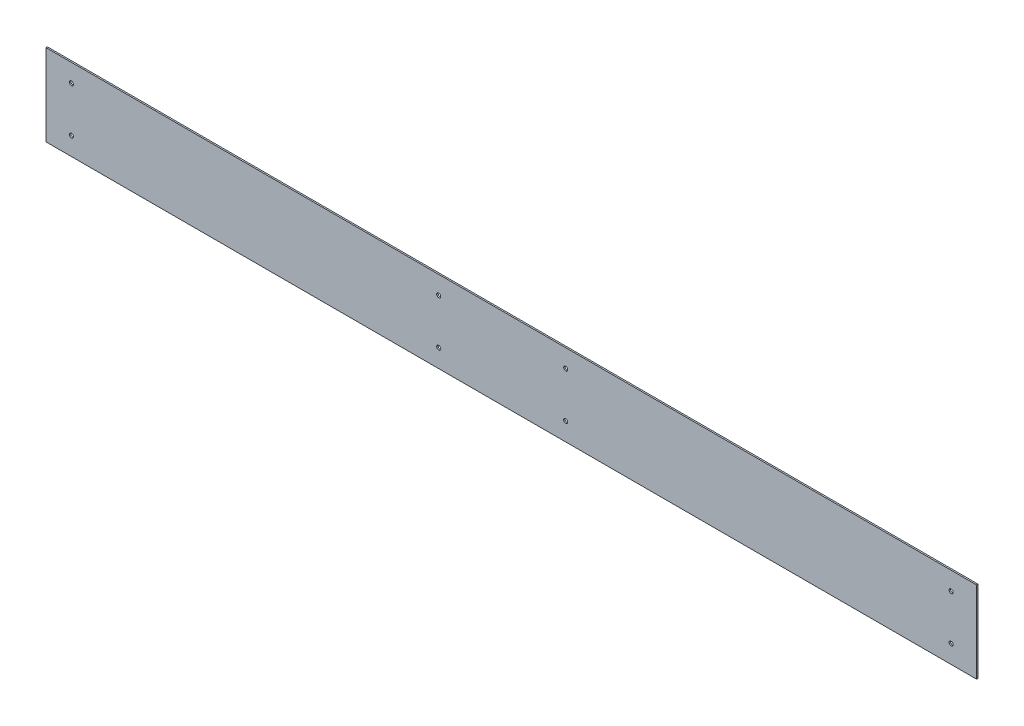
ISO-10303-21;
HEADER;
FILE_DESCRIPTION(('STEP AP214'),'2;1');
FILE_NAME('part.step','',(''),(''),'','','');
FILE_SCHEMA(('AUTOMOTIVE_DESIGN { 1 0 10303 214 1 1 1 1 }'));
ENDSEC;
DATA;
#1=APPLICATION_CONTEXT('core data for automotive mechanical design processes');
#2=APPLICATION_PROTOCOL_DEFINITION('international standard','automotive_design',2000,#1);
#3=PRODUCT_CONTEXT('',#1,'mechanical');
#4=PRODUCT('Part','Part','',(#3));
#5=PRODUCT_RELATED_PRODUCT_CATEGORY('part','',(#4));
#6=PRODUCT_DEFINITION_FORMATION('','',#4);
#7=PRODUCT_DEFINITION_CONTEXT('part definition',#1,'design');
#8=PRODUCT_DEFINITION('design','',#6,#7);
#9=PRODUCT_DEFINITION_SHAPE('','',#8);
#10=(LENGTH_UNIT() NAMED_UNIT(*) SI_UNIT(.MILLI.,.METRE.));
#11=(NAMED_UNIT(*) PLANE_ANGLE_UNIT() SI_UNIT($,.RADIAN.));
#12=(NAMED_UNIT(*) SI_UNIT($,.STERADIAN.) SOLID_ANGLE_UNIT());
#13=UNCERTAINTY_MEASURE_WITH_UNIT(LENGTH_MEASURE(1.E-05),#10,'distance_accuracy_value','');
#14=(GEOMETRIC_REPRESENTATION_CONTEXT(3) GLOBAL_UNCERTAINTY_ASSIGNED_CONTEXT((#13)) GLOBAL_UNIT_ASSIGNED_CONTEXT((#10,
#11,#12)) REPRESENTATION_CONTEXT('',''));
#15=CARTESIAN_POINT('',(0.,0.,0.));
#16=DIRECTION('',(0.,0.,1.));
#17=DIRECTION('',(1.,0.,0.));
#18=AXIS2_PLACEMENT_3D('',#15,#16,#17);
#19=CARTESIAN_POINT('',(0.,0.,1.5875));
#20=DIRECTION('',(0.,0.,-1.));
#21=DIRECTION('',(-1.,0.,0.));
#22=AXIS2_PLACEMENT_3D('',#19,#20,#21);
#23=PLANE('',#22);
#24=CARTESIAN_POINT('',(-485.,25.,1.5875));
#25=DIRECTION('',(0.,0.,1.));
#26=DIRECTION('',(1.,0.,0.));
#27=AXIS2_PLACEMENT_3D('',#24,#25,#26);
#28=CIRCLE('',#27,2.24999999999997);
#29=CARTESIAN_POINT('',(-482.75,25.,1.5875));
#30=VERTEX_POINT('',#29);
#31=EDGE_CURVE('E188',#30,#30,#28,.T.);
#32=ORIENTED_EDGE('',*,*,#31,.F.);
#33=EDGE_LOOP('',(#32));
#34=FACE_BOUND('',#33,.T.);
#35=CARTESIAN_POINT('',(-485.,-25.,1.5875));
#36=DIRECTION('',(0.,0.,1.));
#37=DIRECTION('',(1.,0.,0.));
#38=AXIS2_PLACEMENT_3D('',#35,#36,#37);
#39=CIRCLE('',#38,2.24999999999997);
#40=CARTESIAN_POINT('',(-482.75,-25.,1.5875));
#41=VERTEX_POINT('',#40);
#42=EDGE_CURVE('E180',#41,#41,#39,.T.);
#43=ORIENTED_EDGE('',*,*,#42,.F.);
#44=EDGE_LOOP('',(#43));
#45=FACE_BOUND('',#44,.T.);
#46=CARTESIAN_POINT('',(485.,-25.,1.5875));
#47=DIRECTION('',(0.,0.,1.));
#48=DIRECTION('',(1.,0.,0.));
#49=AXIS2_PLACEMENT_3D('',#46,#47,#48);
#50=CIRCLE('',#49,2.24999999999997);
#51=CARTESIAN_POINT('',(487.25,-25.,1.5875));
#52=VERTEX_POINT('',#51);
#53=EDGE_CURVE('E172',#52,#52,#50,.T.);
#54=ORIENTED_EDGE('',*,*,#53,.F.);
#55=EDGE_LOOP('',(#54));
#56=FACE_BOUND('',#55,.T.);
#57=CARTESIAN_POINT('',(485.,25.,1.5875));
#58=DIRECTION('',(0.,0.,1.));
#59=DIRECTION('',(1.,0.,0.));
#60=AXIS2_PLACEMENT_3D('',#57,#58,#59);
#61=CIRCLE('',#60,2.24999999999997);
#62=CARTESIAN_POINT('',(487.25,25.,1.5875));
#63=VERTEX_POINT('',#62);
#64=EDGE_CURVE('E164',#63,#63,#61,.T.);
#65=ORIENTED_EDGE('',*,*,#64,.F.);
#66=EDGE_LOOP('',(#65));
#67=FACE_BOUND('',#66,.T.);
#68=CARTESIAN_POINT('',(-79.9999999999999,25.,1.5875));
#69=DIRECTION('',(0.,0.,1.));
#70=DIRECTION('',(1.,0.,0.));
#71=AXIS2_PLACEMENT_3D('',#68,#69,#70);
#72=CIRCLE('',#71,2.25);
#73=CARTESIAN_POINT('',(-77.7499999999999,25.,1.5875));
#74=VERTEX_POINT('',#73);
#75=EDGE_CURVE('E156',#74,#74,#72,.T.);
#76=ORIENTED_EDGE('',*,*,#75,.F.);
#77=EDGE_LOOP('',(#76));
#78=FACE_BOUND('',#77,.T.);
#79=CARTESIAN_POINT('',(-79.9999999999999,-25.,1.5875));
#80=DIRECTION('',(0.,0.,1.));
#81=DIRECTION('',(1.,0.,0.));
#82=AXIS2_PLACEMENT_3D('',#79,#80,#81);
#83=CIRCLE('',#82,2.25);
#84=CARTESIAN_POINT('',(-77.7499999999999,-25.,1.5875));
#85=VERTEX_POINT('',#84);
#86=EDGE_CURVE('E148',#85,#85,#83,.T.);
#87=ORIENTED_EDGE('',*,*,#86,.F.);
#88=EDGE_LOOP('',(#87));
#89=FACE_BOUND('',#88,.T.);
#90=CARTESIAN_POINT('',(60.0000000000001,-25.,1.5875));
#91=DIRECTION('',(0.,0.,1.));
#92=DIRECTION('',(1.,0.,0.));
#93=AXIS2_PLACEMENT_3D('',#90,#91,#92);
#94=CIRCLE('',#93,2.25);
#95=CARTESIAN_POINT('',(62.2500000000001,-25.,1.5875));
#96=VERTEX_POINT('',#95);
#97=EDGE_CURVE('E132',#96,#96,#94,.T.);
#98=ORIENTED_EDGE('',*,*,#97,.F.);
#99=EDGE_LOOP('',(#98));
#100=FACE_BOUND('',#99,.T.);
#101=DIRECTION('',(0.,1.,0.));
#102=VECTOR('',#101,1.);
#103=CARTESIAN_POINT('',(513.,-45.,1.5875));
#104=LINE('',#103,#102);
#105=CARTESIAN_POINT('',(513.,-45.,1.5875));
#106=VERTEX_POINT('',#105);
#107=CARTESIAN_POINT('',(513.,45.,1.5875));
#108=VERTEX_POINT('',#107);
#109=EDGE_CURVE('E92',#106,#108,#104,.T.);
#110=ORIENTED_EDGE('',*,*,#109,.T.);
#111=DIRECTION('',(-1.,0.,0.));
#112=VECTOR('',#111,1.);
#113=CARTESIAN_POINT('',(-513.,45.,1.5875));
#114=LINE('',#113,#112);
#115=CARTESIAN_POINT('',(-513.,45.,1.5875));
#116=VERTEX_POINT('',#115);
#117=EDGE_CURVE('E87',#108,#116,#114,.T.);
#118=ORIENTED_EDGE('',*,*,#117,.T.);
#119=DIRECTION('',(0.,-1.,0.));
#120=VECTOR('',#119,1.);
#121=CARTESIAN_POINT('',(-513.,-45.,1.5875));
#122=LINE('',#121,#120);
#123=CARTESIAN_POINT('',(-513.,-45.,1.5875));
#124=VERTEX_POINT('',#123);
#125=EDGE_CURVE('E90',#116,#124,#122,.T.);
#126=ORIENTED_EDGE('',*,*,#125,.T.);
#127=DIRECTION('',(1.,0.,0.));
#128=VECTOR('',#127,1.);
#129=CARTESIAN_POINT('',(-513.,-45.,1.5875));
#130=LINE('',#129,#128);
#131=EDGE_CURVE('E57',#124,#106,#130,.T.);
#132=ORIENTED_EDGE('',*,*,#131,.T.);
#133=EDGE_LOOP('',(#110,#118,#126,#132));
#134=FACE_BOUND('',#133,.T.);
#135=CARTESIAN_POINT('',(60.0000000000001,25.,1.5875));
#136=DIRECTION('',(0.,0.,1.));
#137=DIRECTION('',(1.,0.,0.));
#138=AXIS2_PLACEMENT_3D('',#135,#136,#137);
#139=CIRCLE('',#138,2.25);
#140=CARTESIAN_POINT('',(62.2500000000001,25.,1.5875));
#141=VERTEX_POINT('',#140);
#142=EDGE_CURVE('E140',#141,#141,#139,.T.);
#143=ORIENTED_EDGE('',*,*,#142,.F.);
#144=EDGE_LOOP('',(#143));
#145=FACE_BOUND('',#144,.T.);
#146=ADVANCED_FACE('F39',(#34,#45,#56,#67,#78,#89,#100,#134,#145),#23,.F.);
#147=CARTESIAN_POINT('',(513.,-45.,1.5875));
#148=DIRECTION('',(-1.,0.,0.));
#149=DIRECTION('',(0.,0.,1.));
#150=AXIS2_PLACEMENT_3D('',#147,#148,#149);
#151=PLANE('',#150);
#152=DIRECTION('',(0.,1.,0.));
#153=VECTOR('',#152,1.);
#154=CARTESIAN_POINT('',(513.,-45.,0.));
#155=LINE('',#154,#153);
#156=CARTESIAN_POINT('',(513.,-45.,0.));
#157=VERTEX_POINT('',#156);
#158=CARTESIAN_POINT('',(513.,45.,0.));
#159=VERTEX_POINT('',#158);
#160=EDGE_CURVE('E108',#157,#159,#155,.T.);
#161=ORIENTED_EDGE('',*,*,#160,.T.);
#162=DIRECTION('',(0.,0.,-1.));
#163=VECTOR('',#162,1.);
#164=CARTESIAN_POINT('',(513.,45.,1.5875));
#165=LINE('',#164,#163);
#166=EDGE_CURVE('E11',#108,#159,#165,.T.);
#167=ORIENTED_EDGE('',*,*,#166,.F.);
#168=ORIENTED_EDGE('',*,*,#109,.F.);
#169=DIRECTION('',(0.,0.,-1.));
#170=VECTOR('',#169,1.);
#171=CARTESIAN_POINT('',(513.,-45.,1.5875));
#172=LINE('',#171,#170);
#173=EDGE_CURVE('E104',#106,#157,#172,.T.);
#174=ORIENTED_EDGE('',*,*,#173,.T.);
#175=EDGE_LOOP('',(#161,#167,#168,#174));
#176=FACE_BOUND('',#175,.T.);
#177=ADVANCED_FACE('F41',(#176),#151,.F.);
#178=CARTESIAN_POINT('',(-513.,45.,1.5875));
#179=DIRECTION('',(0.,-1.,0.));
#180=DIRECTION('',(0.,0.,-1.));
#181=AXIS2_PLACEMENT_3D('',#178,#179,#180);
#182=PLANE('',#181);
#183=DIRECTION('',(-1.,0.,0.));
#184=VECTOR('',#183,1.);
#185=CARTESIAN_POINT('',(-513.,45.,0.));
#186=LINE('',#185,#184);
#187=CARTESIAN_POINT('',(-513.,45.,0.));
#188=VERTEX_POINT('',#187);
#189=EDGE_CURVE('E97',#159,#188,#186,.T.);
#190=ORIENTED_EDGE('',*,*,#189,.T.);
#191=DIRECTION('',(0.,0.,-1.));
#192=VECTOR('',#191,1.);
#193=CARTESIAN_POINT('',(-513.,45.,1.5875));
#194=LINE('',#193,#192);
#195=EDGE_CURVE('E49',#116,#188,#194,.T.);
#196=ORIENTED_EDGE('',*,*,#195,.F.);
#197=ORIENTED_EDGE('',*,*,#117,.F.);
#198=ORIENTED_EDGE('',*,*,#166,.T.);
#199=EDGE_LOOP('',(#190,#196,#197,#198));
#200=FACE_BOUND('',#199,.T.);
#201=ADVANCED_FACE('F96',(#200),#182,.F.);
#202=CARTESIAN_POINT('',(-513.,-45.,1.5875));
#203=DIRECTION('',(1.,0.,0.));
#204=DIRECTION('',(0.,0.,-1.));
#205=AXIS2_PLACEMENT_3D('',#202,#203,#204);
#206=PLANE('',#205);
#207=DIRECTION('',(0.,-1.,0.));
#208=VECTOR('',#207,1.);
#209=CARTESIAN_POINT('',(-513.,-45.,0.));
#210=LINE('',#209,#208);
#211=CARTESIAN_POINT('',(-513.,-45.,0.));
#212=VERTEX_POINT('',#211);
#213=EDGE_CURVE('E74',#188,#212,#210,.T.);
#214=ORIENTED_EDGE('',*,*,#213,.T.);
#215=DIRECTION('',(0.,0.,-1.));
#216=VECTOR('',#215,1.);
#217=CARTESIAN_POINT('',(-513.,-45.,1.5875));
#218=LINE('',#217,#216);
#219=EDGE_CURVE('E99',#124,#212,#218,.T.);
#220=ORIENTED_EDGE('',*,*,#219,.F.);
#221=ORIENTED_EDGE('',*,*,#125,.F.);
#222=ORIENTED_EDGE('',*,*,#195,.T.);
#223=EDGE_LOOP('',(#214,#220,#221,#222));
#224=FACE_BOUND('',#223,.T.);
#225=ADVANCED_FACE('F100',(#224),#206,.F.);
#226=CARTESIAN_POINT('',(-513.,-45.,1.5875));
#227=DIRECTION('',(0.,1.,0.));
#228=DIRECTION('',(0.,0.,1.));
#229=AXIS2_PLACEMENT_3D('',#226,#227,#228);
#230=PLANE('',#229);
#231=DIRECTION('',(1.,0.,0.));
#232=VECTOR('',#231,1.);
#233=CARTESIAN_POINT('',(-513.,-45.,0.));
#234=LINE('',#233,#232);
#235=EDGE_CURVE('E80',#212,#157,#234,.T.);
#236=ORIENTED_EDGE('',*,*,#235,.T.);
#237=ORIENTED_EDGE('',*,*,#173,.F.);
#238=ORIENTED_EDGE('',*,*,#131,.F.);
#239=ORIENTED_EDGE('',*,*,#219,.T.);
#240=EDGE_LOOP('',(#236,#237,#238,#239));
#241=FACE_BOUND('',#240,.T.);
#242=ADVANCED_FACE('F122',(#241),#230,.F.);
#243=CARTESIAN_POINT('',(0.,0.,0.));
#244=DIRECTION('',(0.,0.,-1.));
#245=DIRECTION('',(-1.,0.,0.));
#246=AXIS2_PLACEMENT_3D('',#243,#244,#245);
#247=PLANE('',#246);
#248=CARTESIAN_POINT('',(-485.,25.,0.));
#249=DIRECTION('',(0.,0.,1.));
#250=DIRECTION('',(1.,0.,0.));
#251=AXIS2_PLACEMENT_3D('',#248,#249,#250);
#252=CIRCLE('',#251,2.24999999999997);
#253=CARTESIAN_POINT('',(-482.75,25.,0.));
#254=VERTEX_POINT('',#253);
#255=EDGE_CURVE('E184',#254,#254,#252,.T.);
#256=ORIENTED_EDGE('',*,*,#255,.T.);
#257=EDGE_LOOP('',(#256));
#258=FACE_BOUND('',#257,.T.);
#259=CARTESIAN_POINT('',(-485.,-25.,0.));
#260=DIRECTION('',(0.,0.,1.));
#261=DIRECTION('',(1.,0.,0.));
#262=AXIS2_PLACEMENT_3D('',#259,#260,#261);
#263=CIRCLE('',#262,2.24999999999997);
#264=CARTESIAN_POINT('',(-482.75,-25.,0.));
#265=VERTEX_POINT('',#264);
#266=EDGE_CURVE('E176',#265,#265,#263,.T.);
#267=ORIENTED_EDGE('',*,*,#266,.T.);
#268=EDGE_LOOP('',(#267));
#269=FACE_BOUND('',#268,.T.);
#270=CARTESIAN_POINT('',(485.,-25.,0.));
#271=DIRECTION('',(0.,0.,1.));
#272=DIRECTION('',(1.,0.,0.));
#273=AXIS2_PLACEMENT_3D('',#270,#271,#272);
#274=CIRCLE('',#273,2.24999999999997);
#275=CARTESIAN_POINT('',(487.25,-25.,0.));
#276=VERTEX_POINT('',#275);
#277=EDGE_CURVE('E168',#276,#276,#274,.T.);
#278=ORIENTED_EDGE('',*,*,#277,.T.);
#279=EDGE_LOOP('',(#278));
#280=FACE_BOUND('',#279,.T.);
#281=CARTESIAN_POINT('',(485.,25.,0.));
#282=DIRECTION('',(0.,0.,1.));
#283=DIRECTION('',(1.,0.,0.));
#284=AXIS2_PLACEMENT_3D('',#281,#282,#283);
#285=CIRCLE('',#284,2.24999999999997);
#286=CARTESIAN_POINT('',(487.25,25.,0.));
#287=VERTEX_POINT('',#286);
#288=EDGE_CURVE('E160',#287,#287,#285,.T.);
#289=ORIENTED_EDGE('',*,*,#288,.T.);
#290=EDGE_LOOP('',(#289));
#291=FACE_BOUND('',#290,.T.);
#292=CARTESIAN_POINT('',(-79.9999999999999,25.,0.));
#293=DIRECTION('',(0.,0.,1.));
#294=DIRECTION('',(1.,0.,0.));
#295=AXIS2_PLACEMENT_3D('',#292,#293,#294);
#296=CIRCLE('',#295,2.25);
#297=CARTESIAN_POINT('',(-77.7499999999999,25.,0.));
#298=VERTEX_POINT('',#297);
#299=EDGE_CURVE('E152',#298,#298,#296,.T.);
#300=ORIENTED_EDGE('',*,*,#299,.T.);
#301=EDGE_LOOP('',(#300));
#302=FACE_BOUND('',#301,.T.);
#303=CARTESIAN_POINT('',(-79.9999999999999,-25.,0.));
#304=DIRECTION('',(0.,0.,1.));
#305=DIRECTION('',(1.,0.,0.));
#306=AXIS2_PLACEMENT_3D('',#303,#304,#305);
#307=CIRCLE('',#306,2.25);
#308=CARTESIAN_POINT('',(-77.7499999999999,-25.,0.));
#309=VERTEX_POINT('',#308);
#310=EDGE_CURVE('E144',#309,#309,#307,.T.);
#311=ORIENTED_EDGE('',*,*,#310,.T.);
#312=EDGE_LOOP('',(#311));
#313=FACE_BOUND('',#312,.T.);
#314=CARTESIAN_POINT('',(60.0000000000001,25.,0.));
#315=DIRECTION('',(0.,0.,1.));
#316=DIRECTION('',(1.,0.,0.));
#317=AXIS2_PLACEMENT_3D('',#314,#315,#316);
#318=CIRCLE('',#317,2.25);
#319=CARTESIAN_POINT('',(62.2500000000001,25.,0.));
#320=VERTEX_POINT('',#319);
#321=EDGE_CURVE('E136',#320,#320,#318,.T.);
#322=ORIENTED_EDGE('',*,*,#321,.T.);
#323=EDGE_LOOP('',(#322));
#324=FACE_BOUND('',#323,.T.);
#325=CARTESIAN_POINT('',(60.0000000000001,-25.,0.));
#326=DIRECTION('',(0.,0.,1.));
#327=DIRECTION('',(1.,0.,0.));
#328=AXIS2_PLACEMENT_3D('',#325,#326,#327);
#329=CIRCLE('',#328,2.25);
#330=CARTESIAN_POINT('',(62.2500000000001,-25.,0.));
#331=VERTEX_POINT('',#330);
#332=EDGE_CURVE('E112',#331,#331,#329,.T.);
#333=ORIENTED_EDGE('',*,*,#332,.T.);
#334=EDGE_LOOP('',(#333));
#335=FACE_BOUND('',#334,.T.);
#336=ORIENTED_EDGE('',*,*,#160,.F.);
#337=ORIENTED_EDGE('',*,*,#235,.F.);
#338=ORIENTED_EDGE('',*,*,#213,.F.);
#339=ORIENTED_EDGE('',*,*,#189,.F.);
#340=EDGE_LOOP('',(#336,#337,#338,#339));
#341=FACE_BOUND('',#340,.T.);
#342=ADVANCED_FACE('F125',(#258,#269,#280,#291,#302,#313,#324,#335,#341),#247,.T.);
#343=CARTESIAN_POINT('',(60.0000000000001,-25.,1.5875));
#344=DIRECTION('',(0.,0.,1.));
#345=DIRECTION('',(1.,0.,0.));
#346=AXIS2_PLACEMENT_3D('',#343,#344,#345);
#347=CYLINDRICAL_SURFACE('',#346,2.25);
#348=ORIENTED_EDGE('',*,*,#332,.F.);
#349=EDGE_LOOP('',(#348));
#350=FACE_BOUND('',#349,.T.);
#351=ORIENTED_EDGE('',*,*,#97,.T.);
#352=EDGE_LOOP('',(#351));
#353=FACE_BOUND('',#352,.T.);
#354=ADVANCED_FACE('F210',(#350,#353),#347,.F.);
#355=CARTESIAN_POINT('',(60.0000000000001,25.,1.5875));
#356=DIRECTION('',(0.,0.,1.));
#357=DIRECTION('',(1.,0.,0.));
#358=AXIS2_PLACEMENT_3D('',#355,#356,#357);
#359=CYLINDRICAL_SURFACE('',#358,2.25);
#360=ORIENTED_EDGE('',*,*,#321,.F.);
#361=EDGE_LOOP('',(#360));
#362=FACE_BOUND('',#361,.T.);
#363=ORIENTED_EDGE('',*,*,#142,.T.);
#364=EDGE_LOOP('',(#363));
#365=FACE_BOUND('',#364,.T.);
#366=ADVANCED_FACE('F212',(#362,#365),#359,.F.);
#367=CARTESIAN_POINT('',(-79.9999999999999,-25.,1.5875));
#368=DIRECTION('',(0.,0.,1.));
#369=DIRECTION('',(1.,0.,0.));
#370=AXIS2_PLACEMENT_3D('',#367,#368,#369);
#371=CYLINDRICAL_SURFACE('',#370,2.25);
#372=ORIENTED_EDGE('',*,*,#310,.F.);
#373=EDGE_LOOP('',(#372));
#374=FACE_BOUND('',#373,.T.);
#375=ORIENTED_EDGE('',*,*,#86,.T.);
#376=EDGE_LOOP('',(#375));
#377=FACE_BOUND('',#376,.T.);
#378=ADVANCED_FACE('F219',(#374,#377),#371,.F.);
#379=CARTESIAN_POINT('',(-79.9999999999999,25.,1.5875));
#380=DIRECTION('',(0.,0.,1.));
#381=DIRECTION('',(1.,0.,0.));
#382=AXIS2_PLACEMENT_3D('',#379,#380,#381);
#383=CYLINDRICAL_SURFACE('',#382,2.25);
#384=ORIENTED_EDGE('',*,*,#299,.F.);
#385=EDGE_LOOP('',(#384));
#386=FACE_BOUND('',#385,.T.);
#387=ORIENTED_EDGE('',*,*,#75,.T.);
#388=EDGE_LOOP('',(#387));
#389=FACE_BOUND('',#388,.T.);
#390=ADVANCED_FACE('F269',(#386,#389),#383,.F.);
#391=CARTESIAN_POINT('',(485.,25.,1.5875));
#392=DIRECTION('',(0.,0.,1.));
#393=DIRECTION('',(1.,0.,0.));
#394=AXIS2_PLACEMENT_3D('',#391,#392,#393);
#395=CYLINDRICAL_SURFACE('',#394,2.24999999999997);
#396=ORIENTED_EDGE('',*,*,#288,.F.);
#397=EDGE_LOOP('',(#396));
#398=FACE_BOUND('',#397,.T.);
#399=ORIENTED_EDGE('',*,*,#64,.T.);
#400=EDGE_LOOP('',(#399));
#401=FACE_BOUND('',#400,.T.);
#402=ADVANCED_FACE('F278',(#398,#401),#395,.F.);
#403=CARTESIAN_POINT('',(485.,-25.,1.5875));
#404=DIRECTION('',(0.,0.,1.));
#405=DIRECTION('',(1.,0.,0.));
#406=AXIS2_PLACEMENT_3D('',#403,#404,#405);
#407=CYLINDRICAL_SURFACE('',#406,2.24999999999997);
#408=ORIENTED_EDGE('',*,*,#277,.F.);
#409=EDGE_LOOP('',(#408));
#410=FACE_BOUND('',#409,.T.);
#411=ORIENTED_EDGE('',*,*,#53,.T.);
#412=EDGE_LOOP('',(#411));
#413=FACE_BOUND('',#412,.T.);
#414=ADVANCED_FACE('F288',(#410,#413),#407,.F.);
#415=CARTESIAN_POINT('',(-485.,-25.,1.5875));
#416=DIRECTION('',(0.,0.,1.));
#417=DIRECTION('',(1.,0.,0.));
#418=AXIS2_PLACEMENT_3D('',#415,#416,#417);
#419=CYLINDRICAL_SURFACE('',#418,2.24999999999997);
#420=ORIENTED_EDGE('',*,*,#266,.F.);
#421=EDGE_LOOP('',(#420));
#422=FACE_BOUND('',#421,.T.);
#423=ORIENTED_EDGE('',*,*,#42,.T.);
#424=EDGE_LOOP('',(#423));
#425=FACE_BOUND('',#424,.T.);
#426=ADVANCED_FACE('F298',(#422,#425),#419,.F.);
#427=CARTESIAN_POINT('',(-485.,25.,1.5875));
#428=DIRECTION('',(0.,0.,1.));
#429=DIRECTION('',(1.,0.,0.));
#430=AXIS2_PLACEMENT_3D('',#427,#428,#429);
#431=CYLINDRICAL_SURFACE('',#430,2.24999999999997);
#432=ORIENTED_EDGE('',*,*,#255,.F.);
#433=EDGE_LOOP('',(#432));
#434=FACE_BOUND('',#433,.T.);
#435=ORIENTED_EDGE('',*,*,#31,.T.);
#436=EDGE_LOOP('',(#435));
#437=FACE_BOUND('',#436,.T.);
#438=ADVANCED_FACE('F193',(#434,#437),#431,.F.);
#439=CLOSED_SHELL('',(#146,#177,#201,#225,#242,#342,#354,#366,#378,#390,#402,#414,#426,#438));
#440=MANIFOLD_SOLID_BREP('B2',#439);
#441=ADVANCED_BREP_SHAPE_REPRESENTATION('',(#18,#440),#14);
#442=SHAPE_DEFINITION_REPRESENTATION(#9,#441);
ENDSEC;
END-ISO-10303-21;
